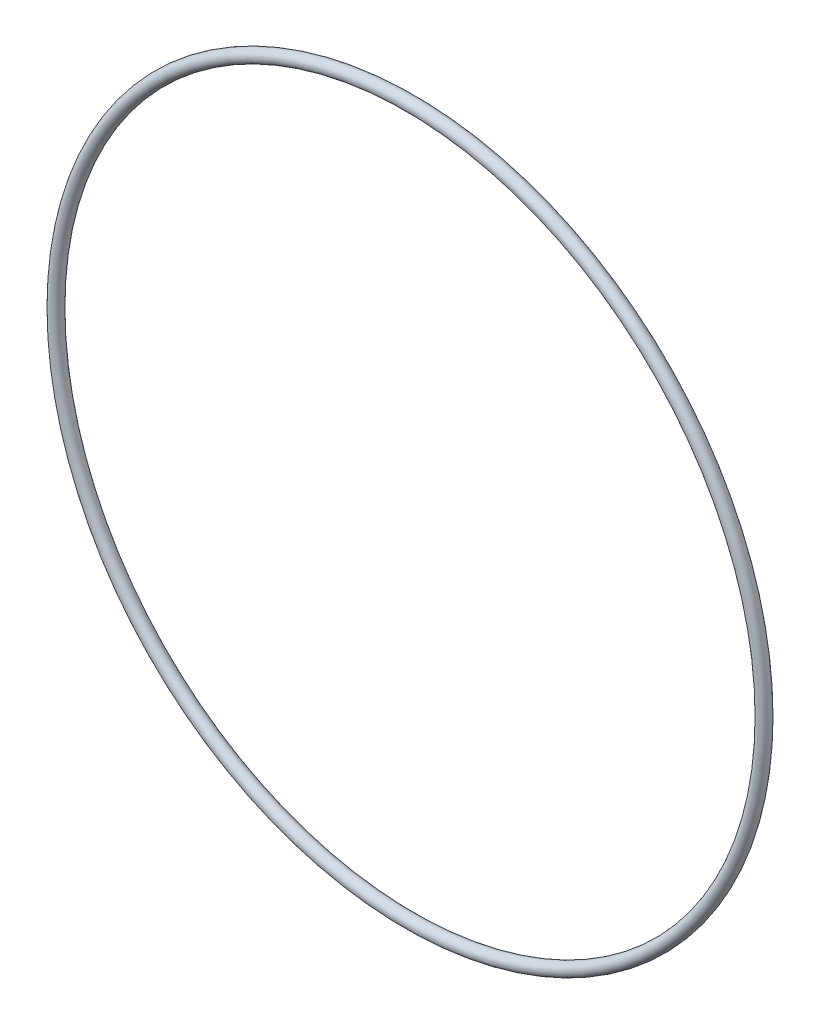
ISO-10303-21;
HEADER;
FILE_DESCRIPTION(('STEP AP214'),'2;1');
FILE_NAME('part.step','',(''),(''),'','','');
FILE_SCHEMA(('AUTOMOTIVE_DESIGN { 1 0 10303 214 1 1 1 1 }'));
ENDSEC;
DATA;
#1=APPLICATION_CONTEXT('core data for automotive mechanical design processes');
#2=APPLICATION_PROTOCOL_DEFINITION('international standard','automotive_design',2000,#1);
#3=PRODUCT_CONTEXT('',#1,'mechanical');
#4=PRODUCT('Part','Part','',(#3));
#5=PRODUCT_RELATED_PRODUCT_CATEGORY('part','',(#4));
#6=PRODUCT_DEFINITION_FORMATION('','',#4);
#7=PRODUCT_DEFINITION_CONTEXT('part definition',#1,'design');
#8=PRODUCT_DEFINITION('design','',#6,#7);
#9=PRODUCT_DEFINITION_SHAPE('','',#8);
#10=(LENGTH_UNIT() NAMED_UNIT(*) SI_UNIT(.MILLI.,.METRE.));
#11=(NAMED_UNIT(*) PLANE_ANGLE_UNIT() SI_UNIT($,.RADIAN.));
#12=(NAMED_UNIT(*) SI_UNIT($,.STERADIAN.) SOLID_ANGLE_UNIT());
#13=UNCERTAINTY_MEASURE_WITH_UNIT(LENGTH_MEASURE(1.E-05),#10,'distance_accuracy_value','');
#14=(GEOMETRIC_REPRESENTATION_CONTEXT(3) GLOBAL_UNCERTAINTY_ASSIGNED_CONTEXT((#13)) GLOBAL_UNIT_ASSIGNED_CONTEXT((#10,
#11,#12)) REPRESENTATION_CONTEXT('',''));
#15=CARTESIAN_POINT('',(0.,0.,0.));
#16=DIRECTION('',(0.,0.,1.));
#17=DIRECTION('',(1.,0.,0.));
#18=AXIS2_PLACEMENT_3D('',#15,#16,#17);
#19=CARTESIAN_POINT('',(0.,0.,0.));
#20=DIRECTION('',(0.,0.,1.));
#21=DIRECTION('',(1.,0.,0.));
#22=AXIS2_PLACEMENT_3D('',#19,#20,#21);
#23=TOROIDAL_SURFACE('',#22,83.75,1.5);
#24=CARTESIAN_POINT('',(85.25,0.,0.));
#25=VERTEX_POINT('',#24);
#26=VERTEX_LOOP('',#25);
#27=FACE_BOUND('',#26,.T.);
#28=ADVANCED_FACE('F42',(#27),#23,.T.);
#29=CLOSED_SHELL('',(#28));
#30=MANIFOLD_SOLID_BREP('B2',#29);
#31=ADVANCED_BREP_SHAPE_REPRESENTATION('',(#18,#30),#14);
#32=SHAPE_DEFINITION_REPRESENTATION(#9,#31);
ENDSEC;
END-ISO-10303-21;
